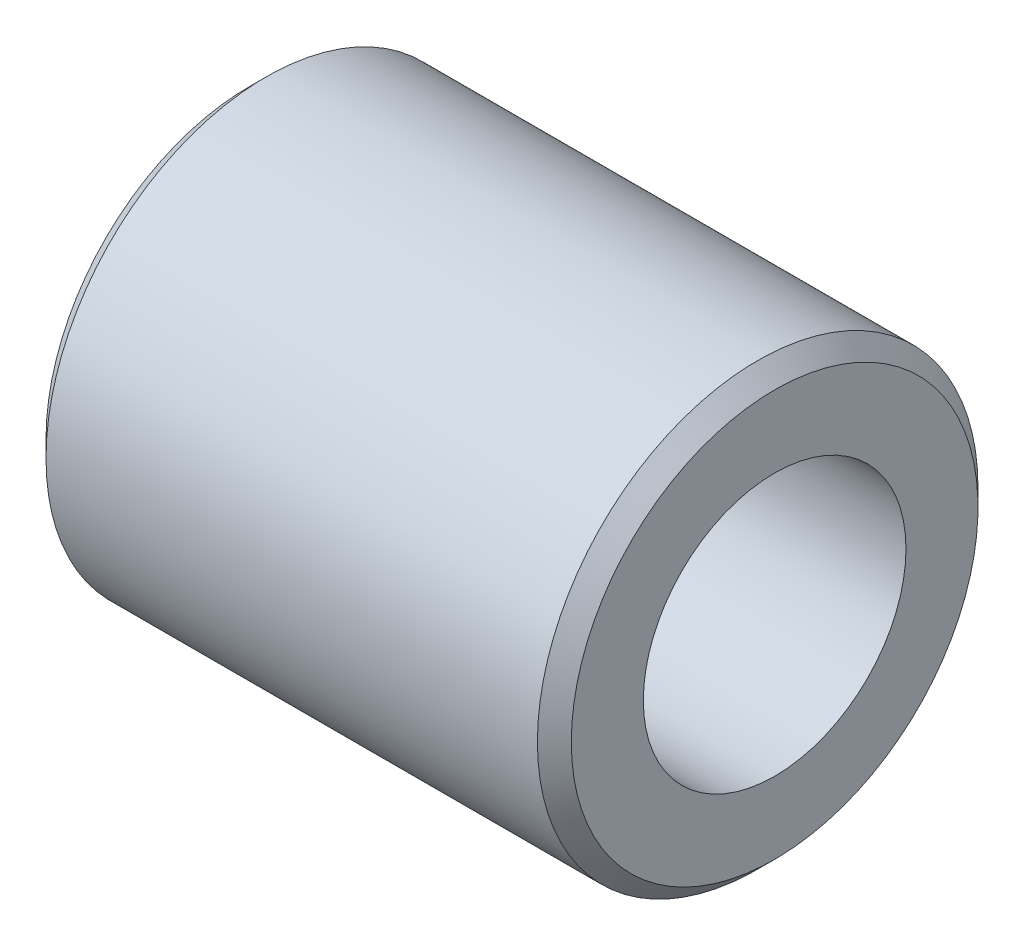
ISO-10303-21;
HEADER;
FILE_DESCRIPTION(('STEP AP214'),'2;1');
FILE_NAME('part.step','',(''),(''),'','','');
FILE_SCHEMA(('AUTOMOTIVE_DESIGN { 1 0 10303 214 1 1 1 1 }'));
ENDSEC;
DATA;
#1=APPLICATION_CONTEXT('core data for automotive mechanical design processes');
#2=APPLICATION_PROTOCOL_DEFINITION('international standard','automotive_design',2000,#1);
#3=PRODUCT_CONTEXT('',#1,'mechanical');
#4=PRODUCT('Part','Part','',(#3));
#5=PRODUCT_RELATED_PRODUCT_CATEGORY('part','',(#4));
#6=PRODUCT_DEFINITION_FORMATION('','',#4);
#7=PRODUCT_DEFINITION_CONTEXT('part definition',#1,'design');
#8=PRODUCT_DEFINITION('design','',#6,#7);
#9=PRODUCT_DEFINITION_SHAPE('','',#8);
#10=(LENGTH_UNIT() NAMED_UNIT(*) SI_UNIT(.MILLI.,.METRE.));
#11=(NAMED_UNIT(*) PLANE_ANGLE_UNIT() SI_UNIT($,.RADIAN.));
#12=(NAMED_UNIT(*) SI_UNIT($,.STERADIAN.) SOLID_ANGLE_UNIT());
#13=UNCERTAINTY_MEASURE_WITH_UNIT(LENGTH_MEASURE(1.E-05),#10,'distance_accuracy_value','');
#14=(GEOMETRIC_REPRESENTATION_CONTEXT(3) GLOBAL_UNCERTAINTY_ASSIGNED_CONTEXT((#13)) GLOBAL_UNIT_ASSIGNED_CONTEXT((#10,
#11,#12)) REPRESENTATION_CONTEXT('',''));
#15=CARTESIAN_POINT('',(0.,0.,0.));
#16=DIRECTION('',(0.,0.,1.));
#17=DIRECTION('',(1.,0.,0.));
#18=AXIS2_PLACEMENT_3D('',#15,#16,#17);
#19=CARTESIAN_POINT('',(-31.,15.5,0.));
#20=DIRECTION('',(1.,0.,0.));
#21=DIRECTION('',(0.,0.,-1.));
#22=AXIS2_PLACEMENT_3D('',#19,#20,#21);
#23=PLANE('',#22);
#24=CARTESIAN_POINT('',(-31.,0.,0.));
#25=DIRECTION('',(-1.,0.,0.));
#26=DIRECTION('',(0.,0.,1.));
#27=AXIS2_PLACEMENT_3D('',#24,#25,#26);
#28=CIRCLE('',#27,15.5);
#29=CARTESIAN_POINT('',(-31.,0.,15.5));
#30=VERTEX_POINT('',#29);
#31=EDGE_CURVE('E59',#30,#30,#28,.T.);
#32=ORIENTED_EDGE('',*,*,#31,.F.);
#33=EDGE_LOOP('',(#32));
#34=FACE_BOUND('',#33,.T.);
#35=CARTESIAN_POINT('',(-31.,0.,0.));
#36=DIRECTION('',(-1.,0.,0.));
#37=DIRECTION('',(0.,0.,1.));
#38=AXIS2_PLACEMENT_3D('',#35,#36,#37);
#39=CIRCLE('',#38,24.);
#40=CARTESIAN_POINT('',(-31.,0.,24.));
#41=VERTEX_POINT('',#40);
#42=EDGE_CURVE('E10',#41,#41,#39,.T.);
#43=ORIENTED_EDGE('',*,*,#42,.T.);
#44=EDGE_LOOP('',(#43));
#45=FACE_BOUND('',#44,.T.);
#46=ADVANCED_FACE('F37',(#34,#45),#23,.F.);
#47=CARTESIAN_POINT('',(-29.,0.,0.));
#48=DIRECTION('',(1.,0.,0.));
#49=DIRECTION('',(0.,0.,-1.));
#50=AXIS2_PLACEMENT_3D('',#47,#48,#49);
#51=CONICAL_SURFACE('',#50,26.,0.785398163397447);
#52=ORIENTED_EDGE('',*,*,#42,.F.);
#53=EDGE_LOOP('',(#52));
#54=FACE_BOUND('',#53,.T.);
#55=CARTESIAN_POINT('',(-29.,0.,0.));
#56=DIRECTION('',(-1.,0.,0.));
#57=DIRECTION('',(0.,0.,1.));
#58=AXIS2_PLACEMENT_3D('',#55,#56,#57);
#59=CIRCLE('',#58,26.);
#60=CARTESIAN_POINT('',(-29.,0.,26.));
#61=VERTEX_POINT('',#60);
#62=EDGE_CURVE('E43',#61,#61,#59,.T.);
#63=ORIENTED_EDGE('',*,*,#62,.T.);
#64=EDGE_LOOP('',(#63));
#65=FACE_BOUND('',#64,.T.);
#66=ADVANCED_FACE('F66',(#54,#65),#51,.T.);
#67=CARTESIAN_POINT('',(-31.,0.,0.));
#68=DIRECTION('',(-1.,0.,0.));
#69=DIRECTION('',(0.,0.,1.));
#70=AXIS2_PLACEMENT_3D('',#67,#68,#69);
#71=CYLINDRICAL_SURFACE('',#70,26.);
#72=ORIENTED_EDGE('',*,*,#62,.F.);
#73=EDGE_LOOP('',(#72));
#74=FACE_BOUND('',#73,.T.);
#75=CARTESIAN_POINT('',(29.,0.,0.));
#76=DIRECTION('',(-1.,0.,0.));
#77=DIRECTION('',(0.,0.,1.));
#78=AXIS2_PLACEMENT_3D('',#75,#76,#77);
#79=CIRCLE('',#78,26.);
#80=CARTESIAN_POINT('',(29.,0.,26.));
#81=VERTEX_POINT('',#80);
#82=EDGE_CURVE('E47',#81,#81,#79,.T.);
#83=ORIENTED_EDGE('',*,*,#82,.T.);
#84=EDGE_LOOP('',(#83));
#85=FACE_BOUND('',#84,.T.);
#86=ADVANCED_FACE('F70',(#74,#85),#71,.T.);
#87=CARTESIAN_POINT('',(31.,0.,0.));
#88=DIRECTION('',(-1.,0.,0.));
#89=DIRECTION('',(0.,0.,1.));
#90=AXIS2_PLACEMENT_3D('',#87,#88,#89);
#91=CONICAL_SURFACE('',#90,24.,0.785398163397447);
#92=ORIENTED_EDGE('',*,*,#82,.F.);
#93=EDGE_LOOP('',(#92));
#94=FACE_BOUND('',#93,.T.);
#95=CARTESIAN_POINT('',(31.,0.,0.));
#96=DIRECTION('',(-1.,0.,0.));
#97=DIRECTION('',(0.,0.,1.));
#98=AXIS2_PLACEMENT_3D('',#95,#96,#97);
#99=CIRCLE('',#98,24.);
#100=CARTESIAN_POINT('',(31.,0.,24.));
#101=VERTEX_POINT('',#100);
#102=EDGE_CURVE('E51',#101,#101,#99,.T.);
#103=ORIENTED_EDGE('',*,*,#102,.T.);
#104=EDGE_LOOP('',(#103));
#105=FACE_BOUND('',#104,.T.);
#106=ADVANCED_FACE('F75',(#94,#105),#91,.T.);
#107=CARTESIAN_POINT('',(31.,15.5,0.));
#108=DIRECTION('',(-1.,0.,0.));
#109=DIRECTION('',(0.,0.,1.));
#110=AXIS2_PLACEMENT_3D('',#107,#108,#109);
#111=PLANE('',#110);
#112=ORIENTED_EDGE('',*,*,#102,.F.);
#113=EDGE_LOOP('',(#112));
#114=FACE_BOUND('',#113,.T.);
#115=CARTESIAN_POINT('',(31.,0.,0.));
#116=DIRECTION('',(-1.,0.,0.));
#117=DIRECTION('',(0.,0.,1.));
#118=AXIS2_PLACEMENT_3D('',#115,#116,#117);
#119=CIRCLE('',#118,15.5);
#120=CARTESIAN_POINT('',(31.,0.,15.5));
#121=VERTEX_POINT('',#120);
#122=EDGE_CURVE('E56',#121,#121,#119,.T.);
#123=ORIENTED_EDGE('',*,*,#122,.T.);
#124=EDGE_LOOP('',(#123));
#125=FACE_BOUND('',#124,.T.);
#126=ADVANCED_FACE('F81',(#114,#125),#111,.F.);
#127=CARTESIAN_POINT('',(-31.,0.,0.));
#128=DIRECTION('',(-1.,0.,0.));
#129=DIRECTION('',(0.,0.,1.));
#130=AXIS2_PLACEMENT_3D('',#127,#128,#129);
#131=CYLINDRICAL_SURFACE('',#130,15.5);
#132=ORIENTED_EDGE('',*,*,#122,.F.);
#133=EDGE_LOOP('',(#132));
#134=FACE_BOUND('',#133,.T.);
#135=ORIENTED_EDGE('',*,*,#31,.T.);
#136=EDGE_LOOP('',(#135));
#137=FACE_BOUND('',#136,.T.);
#138=ADVANCED_FACE('F63',(#134,#137),#131,.F.);
#139=CLOSED_SHELL('',(#46,#66,#86,#106,#126,#138));
#140=MANIFOLD_SOLID_BREP('B2',#139);
#141=ADVANCED_BREP_SHAPE_REPRESENTATION('',(#18,#140),#14);
#142=SHAPE_DEFINITION_REPRESENTATION(#9,#141);
ENDSEC;
END-ISO-10303-21;
